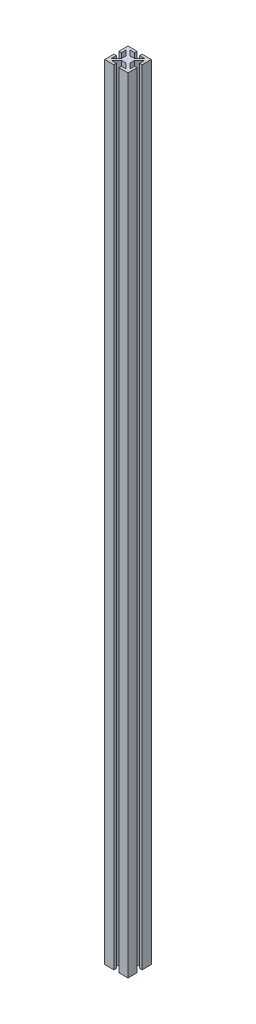
ISO-10303-21;
HEADER;
FILE_DESCRIPTION(('STEP AP214'),'2;1');
FILE_NAME('part.step','',(''),(''),'','','');
FILE_SCHEMA(('AUTOMOTIVE_DESIGN { 1 0 10303 214 1 1 1 1 }'));
ENDSEC;
DATA;
#1=APPLICATION_CONTEXT('core data for automotive mechanical design processes');
#2=APPLICATION_PROTOCOL_DEFINITION('international standard','automotive_design',2000,#1);
#3=PRODUCT_CONTEXT('',#1,'mechanical');
#4=PRODUCT('Part','Part','',(#3));
#5=PRODUCT_RELATED_PRODUCT_CATEGORY('part','',(#4));
#6=PRODUCT_DEFINITION_FORMATION('','',#4);
#7=PRODUCT_DEFINITION_CONTEXT('part definition',#1,'design');
#8=PRODUCT_DEFINITION('design','',#6,#7);
#9=PRODUCT_DEFINITION_SHAPE('','',#8);
#10=(LENGTH_UNIT() NAMED_UNIT(*) SI_UNIT(.MILLI.,.METRE.));
#11=(NAMED_UNIT(*) PLANE_ANGLE_UNIT() SI_UNIT($,.RADIAN.));
#12=(NAMED_UNIT(*) SI_UNIT($,.STERADIAN.) SOLID_ANGLE_UNIT());
#13=UNCERTAINTY_MEASURE_WITH_UNIT(LENGTH_MEASURE(1.E-05),#10,'distance_accuracy_value','');
#14=(GEOMETRIC_REPRESENTATION_CONTEXT(3) GLOBAL_UNCERTAINTY_ASSIGNED_CONTEXT((#13)) GLOBAL_UNIT_ASSIGNED_CONTEXT((#10,
#11,#12)) REPRESENTATION_CONTEXT('',''));
#15=CARTESIAN_POINT('',(0.,0.,0.));
#16=DIRECTION('',(0.,0.,1.));
#17=DIRECTION('',(1.,0.,0.));
#18=AXIS2_PLACEMENT_3D('',#15,#16,#17);
#19=CARTESIAN_POINT('',(-19.05,1282.7,-19.05));
#20=DIRECTION('',(1.,0.,0.));
#21=DIRECTION('',(0.,0.,-1.));
#22=AXIS2_PLACEMENT_3D('',#19,#20,#21);
#23=PLANE('',#22);
#24=DIRECTION('',(0.,0.,1.));
#25=VECTOR('',#24,1.);
#26=CARTESIAN_POINT('',(-19.05,0.,-19.05));
#27=LINE('',#26,#25);
#28=CARTESIAN_POINT('',(-19.05,0.,-19.05));
#29=VERTEX_POINT('',#28);
#30=CARTESIAN_POINT('',(-19.05,0.,-4.06399999999999));
#31=VERTEX_POINT('',#30);
#32=EDGE_CURVE('E299',#29,#31,#27,.T.);
#33=ORIENTED_EDGE('',*,*,#32,.T.);
#34=DIRECTION('',(0.,-1.,0.));
#35=VECTOR('',#34,1.);
#36=CARTESIAN_POINT('',(-19.05,1282.7,-4.06399999999999));
#37=LINE('',#36,#35);
#38=CARTESIAN_POINT('',(-19.05,1282.7,-4.06399999999999));
#39=VERTEX_POINT('',#38);
#40=EDGE_CURVE('E11',#39,#31,#37,.T.);
#41=ORIENTED_EDGE('',*,*,#40,.F.);
#42=DIRECTION('',(0.,0.,1.));
#43=VECTOR('',#42,1.);
#44=CARTESIAN_POINT('',(-19.05,1282.7,-19.05));
#45=LINE('',#44,#43);
#46=CARTESIAN_POINT('',(-19.05,1282.7,-19.05));
#47=VERTEX_POINT('',#46);
#48=EDGE_CURVE('E369',#47,#39,#45,.T.);
#49=ORIENTED_EDGE('',*,*,#48,.F.);
#50=DIRECTION('',(0.,-1.,0.));
#51=VECTOR('',#50,1.);
#52=CARTESIAN_POINT('',(-19.05,1282.7,-19.05));
#53=LINE('',#52,#51);
#54=EDGE_CURVE('E295',#47,#29,#53,.T.);
#55=ORIENTED_EDGE('',*,*,#54,.T.);
#56=EDGE_LOOP('',(#33,#41,#49,#55));
#57=FACE_BOUND('',#56,.T.);
#58=ADVANCED_FACE('F35',(#57),#23,.F.);
#59=CARTESIAN_POINT('',(-19.05,1282.7,-4.06399999999999));
#60=DIRECTION('',(0.,0.,-1.));
#61=DIRECTION('',(-1.,0.,0.));
#62=AXIS2_PLACEMENT_3D('',#59,#60,#61);
#63=PLANE('',#62);
#64=DIRECTION('',(1.,0.,0.));
#65=VECTOR('',#64,1.);
#66=CARTESIAN_POINT('',(-19.05,0.,-4.06399999999999));
#67=LINE('',#66,#65);
#68=CARTESIAN_POINT('',(-14.986,0.,-4.06399999999999));
#69=VERTEX_POINT('',#68);
#70=EDGE_CURVE('E302',#31,#69,#67,.T.);
#71=ORIENTED_EDGE('',*,*,#70,.T.);
#72=DIRECTION('',(0.,-1.,0.));
#73=VECTOR('',#72,1.);
#74=CARTESIAN_POINT('',(-14.986,1282.7,-4.06399999999999));
#75=LINE('',#74,#73);
#76=CARTESIAN_POINT('',(-14.986,1282.7,-4.06399999999999));
#77=VERTEX_POINT('',#76);
#78=EDGE_CURVE('E43',#77,#69,#75,.T.);
#79=ORIENTED_EDGE('',*,*,#78,.F.);
#80=DIRECTION('',(1.,0.,0.));
#81=VECTOR('',#80,1.);
#82=CARTESIAN_POINT('',(-19.05,1282.7,-4.06399999999999));
#83=LINE('',#82,#81);
#84=EDGE_CURVE('E178',#39,#77,#83,.T.);
#85=ORIENTED_EDGE('',*,*,#84,.F.);
#86=ORIENTED_EDGE('',*,*,#40,.T.);
#87=EDGE_LOOP('',(#71,#79,#85,#86));
#88=FACE_BOUND('',#87,.T.);
#89=ADVANCED_FACE('F567',(#88),#63,.F.);
#90=CARTESIAN_POINT('',(-14.986,1282.7,-4.06399999999999));
#91=DIRECTION('',(-1.,0.,0.));
#92=DIRECTION('',(0.,0.,1.));
#93=AXIS2_PLACEMENT_3D('',#90,#91,#92);
#94=PLANE('',#93);
#95=DIRECTION('',(0.,0.,-1.));
#96=VECTOR('',#95,1.);
#97=CARTESIAN_POINT('',(-14.986,0.,-4.06399999999999));
#98=LINE('',#97,#96);
#99=CARTESIAN_POINT('',(-14.986,0.,-12.1123180412578));
#100=VERTEX_POINT('',#99);
#101=EDGE_CURVE('E304',#69,#100,#98,.T.);
#102=ORIENTED_EDGE('',*,*,#101,.T.);
#103=DIRECTION('',(0.,-1.,0.));
#104=VECTOR('',#103,1.);
#105=CARTESIAN_POINT('',(-14.986,1282.7,-12.1123180412578));
#106=LINE('',#105,#104);
#107=CARTESIAN_POINT('',(-14.986,1282.7,-12.1123180412578));
#108=VERTEX_POINT('',#107);
#109=EDGE_CURVE('E460',#108,#100,#106,.T.);
#110=ORIENTED_EDGE('',*,*,#109,.F.);
#111=DIRECTION('',(0.,0.,-1.));
#112=VECTOR('',#111,1.);
#113=CARTESIAN_POINT('',(-14.986,1282.7,-4.06399999999999));
#114=LINE('',#113,#112);
#115=EDGE_CURVE('E468',#77,#108,#114,.T.);
#116=ORIENTED_EDGE('',*,*,#115,.F.);
#117=ORIENTED_EDGE('',*,*,#78,.T.);
#118=EDGE_LOOP('',(#102,#110,#116,#117));
#119=FACE_BOUND('',#118,.T.);
#120=ADVANCED_FACE('F466',(#119),#94,.F.);
#121=CARTESIAN_POINT('',(-14.986,1282.7,-12.1123180412578));
#122=DIRECTION('',(0.707106781186547,0.,-0.707106781186548));
#123=DIRECTION('',(-0.707106781186548,0.,-0.707106781186547));
#124=AXIS2_PLACEMENT_3D('',#121,#122,#123);
#125=PLANE('',#124);
#126=DIRECTION('',(0.707106781186548,0.,0.707106781186547));
#127=VECTOR('',#126,1.);
#128=CARTESIAN_POINT('',(-14.986,0.,-12.1123180412578));
#129=LINE('',#128,#127);
#130=CARTESIAN_POINT('',(-6.7564,0.,-3.88271804125786));
#131=VERTEX_POINT('',#130);
#132=EDGE_CURVE('E306',#100,#131,#129,.T.);
#133=ORIENTED_EDGE('',*,*,#132,.T.);
#134=DIRECTION('',(0.,-1.,0.));
#135=VECTOR('',#134,1.);
#136=CARTESIAN_POINT('',(-6.7564,1282.7,-3.88271804125786));
#137=LINE('',#136,#135);
#138=CARTESIAN_POINT('',(-6.7564,1282.7,-3.88271804125786));
#139=VERTEX_POINT('',#138);
#140=EDGE_CURVE('E457',#139,#131,#137,.T.);
#141=ORIENTED_EDGE('',*,*,#140,.F.);
#142=DIRECTION('',(0.707106781186548,0.,0.707106781186547));
#143=VECTOR('',#142,1.);
#144=CARTESIAN_POINT('',(-14.986,1282.7,-12.1123180412578));
#145=LINE('',#144,#143);
#146=EDGE_CURVE('E486',#108,#139,#145,.T.);
#147=ORIENTED_EDGE('',*,*,#146,.F.);
#148=ORIENTED_EDGE('',*,*,#109,.T.);
#149=EDGE_LOOP('',(#133,#141,#147,#148));
#150=FACE_BOUND('',#149,.T.);
#151=ADVANCED_FACE('F477',(#150),#125,.F.);
#152=CARTESIAN_POINT('',(-6.7564,1282.7,-3.88271804125786));
#153=DIRECTION('',(1.,0.,0.));
#154=DIRECTION('',(0.,0.,-1.));
#155=AXIS2_PLACEMENT_3D('',#152,#153,#154);
#156=PLANE('',#155);
#157=DIRECTION('',(0.,0.,1.));
#158=VECTOR('',#157,1.);
#159=CARTESIAN_POINT('',(-6.7564,0.,-3.88271804125786));
#160=LINE('',#159,#158);
#161=CARTESIAN_POINT('',(-6.7564,0.,3.88271804125787));
#162=VERTEX_POINT('',#161);
#163=EDGE_CURVE('E308',#131,#162,#160,.T.);
#164=ORIENTED_EDGE('',*,*,#163,.T.);
#165=DIRECTION('',(0.,-1.,0.));
#166=VECTOR('',#165,1.);
#167=CARTESIAN_POINT('',(-6.7564,1282.7,3.88271804125787));
#168=LINE('',#167,#166);
#169=CARTESIAN_POINT('',(-6.7564,1282.7,3.88271804125787));
#170=VERTEX_POINT('',#169);
#171=EDGE_CURVE('E454',#170,#162,#168,.T.);
#172=ORIENTED_EDGE('',*,*,#171,.F.);
#173=DIRECTION('',(0.,0.,1.));
#174=VECTOR('',#173,1.);
#175=CARTESIAN_POINT('',(-6.7564,1282.7,-3.88271804125786));
#176=LINE('',#175,#174);
#177=EDGE_CURVE('E483',#139,#170,#176,.T.);
#178=ORIENTED_EDGE('',*,*,#177,.F.);
#179=ORIENTED_EDGE('',*,*,#140,.T.);
#180=EDGE_LOOP('',(#164,#172,#178,#179));
#181=FACE_BOUND('',#180,.T.);
#182=ADVANCED_FACE('F481',(#181),#156,.F.);
#183=CARTESIAN_POINT('',(-14.986,1282.7,12.1123180412579));
#184=DIRECTION('',(0.707106781186548,0.,0.707106781186547));
#185=DIRECTION('',(0.707106781186547,0.,-0.707106781186548));
#186=AXIS2_PLACEMENT_3D('',#183,#184,#185);
#187=PLANE('',#186);
#188=DIRECTION('',(-0.707106781186547,0.,0.707106781186548));
#189=VECTOR('',#188,1.);
#190=CARTESIAN_POINT('',(-14.986,0.,12.1123180412579));
#191=LINE('',#190,#189);
#192=CARTESIAN_POINT('',(-14.986,0.,12.1123180412579));
#193=VERTEX_POINT('',#192);
#194=EDGE_CURVE('E310',#162,#193,#191,.T.);
#195=ORIENTED_EDGE('',*,*,#194,.T.);
#196=DIRECTION('',(0.,-1.,0.));
#197=VECTOR('',#196,1.);
#198=CARTESIAN_POINT('',(-14.986,1282.7,12.1123180412579));
#199=LINE('',#198,#197);
#200=CARTESIAN_POINT('',(-14.986,1282.7,12.1123180412579));
#201=VERTEX_POINT('',#200);
#202=EDGE_CURVE('E451',#201,#193,#199,.T.);
#203=ORIENTED_EDGE('',*,*,#202,.F.);
#204=DIRECTION('',(-0.707106781186547,0.,0.707106781186548));
#205=VECTOR('',#204,1.);
#206=CARTESIAN_POINT('',(-14.986,1282.7,12.1123180412579));
#207=LINE('',#206,#205);
#208=EDGE_CURVE('E485',#170,#201,#207,.T.);
#209=ORIENTED_EDGE('',*,*,#208,.F.);
#210=ORIENTED_EDGE('',*,*,#171,.T.);
#211=EDGE_LOOP('',(#195,#203,#209,#210));
#212=FACE_BOUND('',#211,.T.);
#213=ADVANCED_FACE('F580',(#212),#187,.F.);
#214=CARTESIAN_POINT('',(-14.986,1282.7,4.06399999999999));
#215=DIRECTION('',(-1.,0.,0.));
#216=DIRECTION('',(0.,0.,1.));
#217=AXIS2_PLACEMENT_3D('',#214,#215,#216);
#218=PLANE('',#217);
#219=DIRECTION('',(0.,0.,-1.));
#220=VECTOR('',#219,1.);
#221=CARTESIAN_POINT('',(-14.986,0.,4.06399999999999));
#222=LINE('',#221,#220);
#223=CARTESIAN_POINT('',(-14.986,0.,4.06399999999999));
#224=VERTEX_POINT('',#223);
#225=EDGE_CURVE('E312',#193,#224,#222,.T.);
#226=ORIENTED_EDGE('',*,*,#225,.T.);
#227=DIRECTION('',(0.,-1.,0.));
#228=VECTOR('',#227,1.);
#229=CARTESIAN_POINT('',(-14.986,1282.7,4.06399999999999));
#230=LINE('',#229,#228);
#231=CARTESIAN_POINT('',(-14.986,1282.7,4.06399999999999));
#232=VERTEX_POINT('',#231);
#233=EDGE_CURVE('E448',#232,#224,#230,.T.);
#234=ORIENTED_EDGE('',*,*,#233,.F.);
#235=DIRECTION('',(0.,0.,-1.));
#236=VECTOR('',#235,1.);
#237=CARTESIAN_POINT('',(-14.986,1282.7,4.06399999999999));
#238=LINE('',#237,#236);
#239=EDGE_CURVE('E488',#201,#232,#238,.T.);
#240=ORIENTED_EDGE('',*,*,#239,.F.);
#241=ORIENTED_EDGE('',*,*,#202,.T.);
#242=EDGE_LOOP('',(#226,#234,#240,#241));
#243=FACE_BOUND('',#242,.T.);
#244=ADVANCED_FACE('F583',(#243),#218,.F.);
#245=CARTESIAN_POINT('',(-19.05,1282.7,4.06399999999999));
#246=DIRECTION('',(0.,0.,1.));
#247=DIRECTION('',(1.,0.,0.));
#248=AXIS2_PLACEMENT_3D('',#245,#246,#247);
#249=PLANE('',#248);
#250=DIRECTION('',(-1.,0.,0.));
#251=VECTOR('',#250,1.);
#252=CARTESIAN_POINT('',(-19.05,0.,4.06399999999999));
#253=LINE('',#252,#251);
#254=CARTESIAN_POINT('',(-19.05,0.,4.06399999999999));
#255=VERTEX_POINT('',#254);
#256=EDGE_CURVE('E314',#224,#255,#253,.T.);
#257=ORIENTED_EDGE('',*,*,#256,.T.);
#258=DIRECTION('',(0.,-1.,0.));
#259=VECTOR('',#258,1.);
#260=CARTESIAN_POINT('',(-19.05,1282.7,4.06399999999999));
#261=LINE('',#260,#259);
#262=CARTESIAN_POINT('',(-19.05,1282.7,4.06399999999999));
#263=VERTEX_POINT('',#262);
#264=EDGE_CURVE('E445',#263,#255,#261,.T.);
#265=ORIENTED_EDGE('',*,*,#264,.F.);
#266=DIRECTION('',(-1.,0.,0.));
#267=VECTOR('',#266,1.);
#268=CARTESIAN_POINT('',(-19.05,1282.7,4.06399999999999));
#269=LINE('',#268,#267);
#270=EDGE_CURVE('E494',#232,#263,#269,.T.);
#271=ORIENTED_EDGE('',*,*,#270,.F.);
#272=ORIENTED_EDGE('',*,*,#233,.T.);
#273=EDGE_LOOP('',(#257,#265,#271,#272));
#274=FACE_BOUND('',#273,.T.);
#275=ADVANCED_FACE('F587',(#274),#249,.F.);
#276=CARTESIAN_POINT('',(-19.05,1282.7,19.05));
#277=DIRECTION('',(1.,0.,0.));
#278=DIRECTION('',(0.,0.,-1.));
#279=AXIS2_PLACEMENT_3D('',#276,#277,#278);
#280=PLANE('',#279);
#281=DIRECTION('',(0.,0.,1.));
#282=VECTOR('',#281,1.);
#283=CARTESIAN_POINT('',(-19.05,0.,19.05));
#284=LINE('',#283,#282);
#285=CARTESIAN_POINT('',(-19.05,0.,19.05));
#286=VERTEX_POINT('',#285);
#287=EDGE_CURVE('E316',#255,#286,#284,.T.);
#288=ORIENTED_EDGE('',*,*,#287,.T.);
#289=DIRECTION('',(0.,-1.,0.));
#290=VECTOR('',#289,1.);
#291=CARTESIAN_POINT('',(-19.05,1282.7,19.05));
#292=LINE('',#291,#290);
#293=CARTESIAN_POINT('',(-19.05,1282.7,19.05));
#294=VERTEX_POINT('',#293);
#295=EDGE_CURVE('E442',#294,#286,#292,.T.);
#296=ORIENTED_EDGE('',*,*,#295,.F.);
#297=DIRECTION('',(0.,0.,1.));
#298=VECTOR('',#297,1.);
#299=CARTESIAN_POINT('',(-19.05,1282.7,19.05));
#300=LINE('',#299,#298);
#301=EDGE_CURVE('E496',#263,#294,#300,.T.);
#302=ORIENTED_EDGE('',*,*,#301,.F.);
#303=ORIENTED_EDGE('',*,*,#264,.T.);
#304=EDGE_LOOP('',(#288,#296,#302,#303));
#305=FACE_BOUND('',#304,.T.);
#306=ADVANCED_FACE('F591',(#305),#280,.F.);
#307=CARTESIAN_POINT('',(-19.05,1282.7,19.05));
#308=DIRECTION('',(0.,0.,-1.));
#309=DIRECTION('',(-1.,0.,0.));
#310=AXIS2_PLACEMENT_3D('',#307,#308,#309);
#311=PLANE('',#310);
#312=DIRECTION('',(1.,0.,0.));
#313=VECTOR('',#312,1.);
#314=CARTESIAN_POINT('',(-19.05,0.,19.05));
#315=LINE('',#314,#313);
#316=CARTESIAN_POINT('',(-4.064,0.,19.05));
#317=VERTEX_POINT('',#316);
#318=EDGE_CURVE('E318',#286,#317,#315,.T.);
#319=ORIENTED_EDGE('',*,*,#318,.T.);
#320=DIRECTION('',(0.,-1.,0.));
#321=VECTOR('',#320,1.);
#322=CARTESIAN_POINT('',(-4.064,1282.7,19.05));
#323=LINE('',#322,#321);
#324=CARTESIAN_POINT('',(-4.064,1282.7,19.05));
#325=VERTEX_POINT('',#324);
#326=EDGE_CURVE('E439',#325,#317,#323,.T.);
#327=ORIENTED_EDGE('',*,*,#326,.F.);
#328=DIRECTION('',(1.,0.,0.));
#329=VECTOR('',#328,1.);
#330=CARTESIAN_POINT('',(-19.05,1282.7,19.05));
#331=LINE('',#330,#329);
#332=EDGE_CURVE('E498',#294,#325,#331,.T.);
#333=ORIENTED_EDGE('',*,*,#332,.F.);
#334=ORIENTED_EDGE('',*,*,#295,.T.);
#335=EDGE_LOOP('',(#319,#327,#333,#334));
#336=FACE_BOUND('',#335,.T.);
#337=ADVANCED_FACE('F595',(#336),#311,.F.);
#338=CARTESIAN_POINT('',(-4.064,1282.7,19.05));
#339=DIRECTION('',(-1.,0.,0.));
#340=DIRECTION('',(0.,0.,1.));
#341=AXIS2_PLACEMENT_3D('',#338,#339,#340);
#342=PLANE('',#341);
#343=DIRECTION('',(0.,0.,-1.));
#344=VECTOR('',#343,1.);
#345=CARTESIAN_POINT('',(-4.064,0.,19.05));
#346=LINE('',#345,#344);
#347=CARTESIAN_POINT('',(-4.064,0.,14.986));
#348=VERTEX_POINT('',#347);
#349=EDGE_CURVE('E320',#317,#348,#346,.T.);
#350=ORIENTED_EDGE('',*,*,#349,.T.);
#351=DIRECTION('',(0.,-1.,0.));
#352=VECTOR('',#351,1.);
#353=CARTESIAN_POINT('',(-4.064,1282.7,14.986));
#354=LINE('',#353,#352);
#355=CARTESIAN_POINT('',(-4.064,1282.7,14.986));
#356=VERTEX_POINT('',#355);
#357=EDGE_CURVE('E436',#356,#348,#354,.T.);
#358=ORIENTED_EDGE('',*,*,#357,.F.);
#359=DIRECTION('',(0.,0.,-1.));
#360=VECTOR('',#359,1.);
#361=CARTESIAN_POINT('',(-4.064,1282.7,19.05));
#362=LINE('',#361,#360);
#363=EDGE_CURVE('E500',#325,#356,#362,.T.);
#364=ORIENTED_EDGE('',*,*,#363,.F.);
#365=ORIENTED_EDGE('',*,*,#326,.T.);
#366=EDGE_LOOP('',(#350,#358,#364,#365));
#367=FACE_BOUND('',#366,.T.);
#368=ADVANCED_FACE('F599',(#367),#342,.F.);
#369=CARTESIAN_POINT('',(-4.064,1282.7,14.986));
#370=DIRECTION('',(0.,0.,1.));
#371=DIRECTION('',(1.,0.,0.));
#372=AXIS2_PLACEMENT_3D('',#369,#370,#371);
#373=PLANE('',#372);
#374=DIRECTION('',(-1.,0.,0.));
#375=VECTOR('',#374,1.);
#376=CARTESIAN_POINT('',(-4.064,0.,14.986));
#377=LINE('',#376,#375);
#378=CARTESIAN_POINT('',(-12.1123180412579,0.,14.986));
#379=VERTEX_POINT('',#378);
#380=EDGE_CURVE('E322',#348,#379,#377,.T.);
#381=ORIENTED_EDGE('',*,*,#380,.T.);
#382=DIRECTION('',(0.,-1.,0.));
#383=VECTOR('',#382,1.);
#384=CARTESIAN_POINT('',(-12.1123180412579,1282.7,14.986));
#385=LINE('',#384,#383);
#386=CARTESIAN_POINT('',(-12.1123180412579,1282.7,14.986));
#387=VERTEX_POINT('',#386);
#388=EDGE_CURVE('E433',#387,#379,#385,.T.);
#389=ORIENTED_EDGE('',*,*,#388,.F.);
#390=DIRECTION('',(-1.,0.,0.));
#391=VECTOR('',#390,1.);
#392=CARTESIAN_POINT('',(-4.064,1282.7,14.986));
#393=LINE('',#392,#391);
#394=EDGE_CURVE('E502',#356,#387,#393,.T.);
#395=ORIENTED_EDGE('',*,*,#394,.F.);
#396=ORIENTED_EDGE('',*,*,#357,.T.);
#397=EDGE_LOOP('',(#381,#389,#395,#396));
#398=FACE_BOUND('',#397,.T.);
#399=ADVANCED_FACE('F603',(#398),#373,.F.);
#400=CARTESIAN_POINT('',(-12.1123180412579,1282.7,14.986));
#401=DIRECTION('',(-0.707106781186548,0.,-0.707106781186547));
#402=DIRECTION('',(-0.707106781186547,0.,0.707106781186548));
#403=AXIS2_PLACEMENT_3D('',#400,#401,#402);
#404=PLANE('',#403);
#405=DIRECTION('',(0.707106781186547,0.,-0.707106781186548));
#406=VECTOR('',#405,1.);
#407=CARTESIAN_POINT('',(-12.1123180412579,0.,14.986));
#408=LINE('',#407,#406);
#409=CARTESIAN_POINT('',(-3.88271804125786,0.,6.7564));
#410=VERTEX_POINT('',#409);
#411=EDGE_CURVE('E324',#379,#410,#408,.T.);
#412=ORIENTED_EDGE('',*,*,#411,.T.);
#413=DIRECTION('',(0.,-1.,0.));
#414=VECTOR('',#413,1.);
#415=CARTESIAN_POINT('',(-3.88271804125786,1282.7,6.7564));
#416=LINE('',#415,#414);
#417=CARTESIAN_POINT('',(-3.88271804125786,1282.7,6.7564));
#418=VERTEX_POINT('',#417);
#419=EDGE_CURVE('E430',#418,#410,#416,.T.);
#420=ORIENTED_EDGE('',*,*,#419,.F.);
#421=DIRECTION('',(0.707106781186547,0.,-0.707106781186548));
#422=VECTOR('',#421,1.);
#423=CARTESIAN_POINT('',(-12.1123180412579,1282.7,14.986));
#424=LINE('',#423,#422);
#425=EDGE_CURVE('E504',#387,#418,#424,.T.);
#426=ORIENTED_EDGE('',*,*,#425,.F.);
#427=ORIENTED_EDGE('',*,*,#388,.T.);
#428=EDGE_LOOP('',(#412,#420,#426,#427));
#429=FACE_BOUND('',#428,.T.);
#430=ADVANCED_FACE('F607',(#429),#404,.F.);
#431=CARTESIAN_POINT('',(-3.88271804125786,1282.7,6.7564));
#432=DIRECTION('',(0.,0.,-1.));
#433=DIRECTION('',(-1.,0.,0.));
#434=AXIS2_PLACEMENT_3D('',#431,#432,#433);
#435=PLANE('',#434);
#436=DIRECTION('',(1.,0.,0.));
#437=VECTOR('',#436,1.);
#438=CARTESIAN_POINT('',(-3.88271804125786,0.,6.7564));
#439=LINE('',#438,#437);
#440=CARTESIAN_POINT('',(3.88271804125786,0.,6.7564));
#441=VERTEX_POINT('',#440);
#442=EDGE_CURVE('E326',#410,#441,#439,.T.);
#443=ORIENTED_EDGE('',*,*,#442,.T.);
#444=DIRECTION('',(0.,-1.,0.));
#445=VECTOR('',#444,1.);
#446=CARTESIAN_POINT('',(3.88271804125786,1282.7,6.7564));
#447=LINE('',#446,#445);
#448=CARTESIAN_POINT('',(3.88271804125786,1282.7,6.7564));
#449=VERTEX_POINT('',#448);
#450=EDGE_CURVE('E427',#449,#441,#447,.T.);
#451=ORIENTED_EDGE('',*,*,#450,.F.);
#452=DIRECTION('',(1.,0.,0.));
#453=VECTOR('',#452,1.);
#454=CARTESIAN_POINT('',(-3.88271804125786,1282.7,6.7564));
#455=LINE('',#454,#453);
#456=EDGE_CURVE('E506',#418,#449,#455,.T.);
#457=ORIENTED_EDGE('',*,*,#456,.F.);
#458=ORIENTED_EDGE('',*,*,#419,.T.);
#459=EDGE_LOOP('',(#443,#451,#457,#458));
#460=FACE_BOUND('',#459,.T.);
#461=ADVANCED_FACE('F611',(#460),#435,.F.);
#462=CARTESIAN_POINT('',(12.1123180412579,1282.7,14.986));
#463=DIRECTION('',(0.707106781186548,0.,-0.707106781186548));
#464=DIRECTION('',(-0.707106781186548,0.,-0.707106781186548));
#465=AXIS2_PLACEMENT_3D('',#462,#463,#464);
#466=PLANE('',#465);
#467=DIRECTION('',(0.707106781186547,0.,0.707106781186547));
#468=VECTOR('',#467,1.);
#469=CARTESIAN_POINT('',(12.1123180412579,0.,14.986));
#470=LINE('',#469,#468);
#471=CARTESIAN_POINT('',(12.1123180412579,0.,14.986));
#472=VERTEX_POINT('',#471);
#473=EDGE_CURVE('E328',#441,#472,#470,.T.);
#474=ORIENTED_EDGE('',*,*,#473,.T.);
#475=DIRECTION('',(0.,-1.,0.));
#476=VECTOR('',#475,1.);
#477=CARTESIAN_POINT('',(12.1123180412579,1282.7,14.986));
#478=LINE('',#477,#476);
#479=CARTESIAN_POINT('',(12.1123180412579,1282.7,14.986));
#480=VERTEX_POINT('',#479);
#481=EDGE_CURVE('E424',#480,#472,#478,.T.);
#482=ORIENTED_EDGE('',*,*,#481,.F.);
#483=DIRECTION('',(0.707106781186547,0.,0.707106781186547));
#484=VECTOR('',#483,1.);
#485=CARTESIAN_POINT('',(12.1123180412579,1282.7,14.986));
#486=LINE('',#485,#484);
#487=EDGE_CURVE('E508',#449,#480,#486,.T.);
#488=ORIENTED_EDGE('',*,*,#487,.F.);
#489=ORIENTED_EDGE('',*,*,#450,.T.);
#490=EDGE_LOOP('',(#474,#482,#488,#489));
#491=FACE_BOUND('',#490,.T.);
#492=ADVANCED_FACE('F615',(#491),#466,.F.);
#493=CARTESIAN_POINT('',(4.064,1282.7,14.986));
#494=DIRECTION('',(0.,0.,1.));
#495=DIRECTION('',(1.,0.,0.));
#496=AXIS2_PLACEMENT_3D('',#493,#494,#495);
#497=PLANE('',#496);
#498=DIRECTION('',(-1.,0.,0.));
#499=VECTOR('',#498,1.);
#500=CARTESIAN_POINT('',(4.064,0.,14.986));
#501=LINE('',#500,#499);
#502=CARTESIAN_POINT('',(4.064,0.,14.986));
#503=VERTEX_POINT('',#502);
#504=EDGE_CURVE('E330',#472,#503,#501,.T.);
#505=ORIENTED_EDGE('',*,*,#504,.T.);
#506=DIRECTION('',(0.,-1.,0.));
#507=VECTOR('',#506,1.);
#508=CARTESIAN_POINT('',(4.064,1282.7,14.986));
#509=LINE('',#508,#507);
#510=CARTESIAN_POINT('',(4.064,1282.7,14.986));
#511=VERTEX_POINT('',#510);
#512=EDGE_CURVE('E421',#511,#503,#509,.T.);
#513=ORIENTED_EDGE('',*,*,#512,.F.);
#514=DIRECTION('',(-1.,0.,0.));
#515=VECTOR('',#514,1.);
#516=CARTESIAN_POINT('',(4.064,1282.7,14.986));
#517=LINE('',#516,#515);
#518=EDGE_CURVE('E510',#480,#511,#517,.T.);
#519=ORIENTED_EDGE('',*,*,#518,.F.);
#520=ORIENTED_EDGE('',*,*,#481,.T.);
#521=EDGE_LOOP('',(#505,#513,#519,#520));
#522=FACE_BOUND('',#521,.T.);
#523=ADVANCED_FACE('F619',(#522),#497,.F.);
#524=CARTESIAN_POINT('',(4.06400000000001,1282.7,19.05));
#525=DIRECTION('',(1.,0.,0.));
#526=DIRECTION('',(0.,0.,-1.));
#527=AXIS2_PLACEMENT_3D('',#524,#525,#526);
#528=PLANE('',#527);
#529=DIRECTION('',(0.,0.,1.));
#530=VECTOR('',#529,1.);
#531=CARTESIAN_POINT('',(4.06400000000001,0.,19.05));
#532=LINE('',#531,#530);
#533=CARTESIAN_POINT('',(4.06400000000001,0.,19.05));
#534=VERTEX_POINT('',#533);
#535=EDGE_CURVE('E332',#503,#534,#532,.T.);
#536=ORIENTED_EDGE('',*,*,#535,.T.);
#537=DIRECTION('',(0.,-1.,0.));
#538=VECTOR('',#537,1.);
#539=CARTESIAN_POINT('',(4.06400000000001,1282.7,19.05));
#540=LINE('',#539,#538);
#541=CARTESIAN_POINT('',(4.06400000000001,1282.7,19.05));
#542=VERTEX_POINT('',#541);
#543=EDGE_CURVE('E418',#542,#534,#540,.T.);
#544=ORIENTED_EDGE('',*,*,#543,.F.);
#545=DIRECTION('',(0.,0.,1.));
#546=VECTOR('',#545,1.);
#547=CARTESIAN_POINT('',(4.06400000000001,1282.7,19.05));
#548=LINE('',#547,#546);
#549=EDGE_CURVE('E512',#511,#542,#548,.T.);
#550=ORIENTED_EDGE('',*,*,#549,.F.);
#551=ORIENTED_EDGE('',*,*,#512,.T.);
#552=EDGE_LOOP('',(#536,#544,#550,#551));
#553=FACE_BOUND('',#552,.T.);
#554=ADVANCED_FACE('F623',(#553),#528,.F.);
#555=CARTESIAN_POINT('',(19.05,1282.7,19.05));
#556=DIRECTION('',(0.,0.,-1.));
#557=DIRECTION('',(-1.,0.,0.));
#558=AXIS2_PLACEMENT_3D('',#555,#556,#557);
#559=PLANE('',#558);
#560=DIRECTION('',(1.,0.,0.));
#561=VECTOR('',#560,1.);
#562=CARTESIAN_POINT('',(19.05,0.,19.05));
#563=LINE('',#562,#561);
#564=CARTESIAN_POINT('',(19.05,0.,19.05));
#565=VERTEX_POINT('',#564);
#566=EDGE_CURVE('E334',#534,#565,#563,.T.);
#567=ORIENTED_EDGE('',*,*,#566,.T.);
#568=DIRECTION('',(0.,-1.,0.));
#569=VECTOR('',#568,1.);
#570=CARTESIAN_POINT('',(19.05,1282.7,19.05));
#571=LINE('',#570,#569);
#572=CARTESIAN_POINT('',(19.05,1282.7,19.05));
#573=VERTEX_POINT('',#572);
#574=EDGE_CURVE('E415',#573,#565,#571,.T.);
#575=ORIENTED_EDGE('',*,*,#574,.F.);
#576=DIRECTION('',(1.,0.,0.));
#577=VECTOR('',#576,1.);
#578=CARTESIAN_POINT('',(19.05,1282.7,19.05));
#579=LINE('',#578,#577);
#580=EDGE_CURVE('E514',#542,#573,#579,.T.);
#581=ORIENTED_EDGE('',*,*,#580,.F.);
#582=ORIENTED_EDGE('',*,*,#543,.T.);
#583=EDGE_LOOP('',(#567,#575,#581,#582));
#584=FACE_BOUND('',#583,.T.);
#585=ADVANCED_FACE('F627',(#584),#559,.F.);
#586=CARTESIAN_POINT('',(19.05,1282.7,19.05));
#587=DIRECTION('',(-1.,0.,0.));
#588=DIRECTION('',(0.,0.,1.));
#589=AXIS2_PLACEMENT_3D('',#586,#587,#588);
#590=PLANE('',#589);
#591=DIRECTION('',(0.,0.,-1.));
#592=VECTOR('',#591,1.);
#593=CARTESIAN_POINT('',(19.05,0.,19.05));
#594=LINE('',#593,#592);
#595=CARTESIAN_POINT('',(19.05,0.,4.06399999999999));
#596=VERTEX_POINT('',#595);
#597=EDGE_CURVE('E336',#565,#596,#594,.T.);
#598=ORIENTED_EDGE('',*,*,#597,.T.);
#599=DIRECTION('',(0.,-1.,0.));
#600=VECTOR('',#599,1.);
#601=CARTESIAN_POINT('',(19.05,1282.7,4.06399999999999));
#602=LINE('',#601,#600);
#603=CARTESIAN_POINT('',(19.05,1282.7,4.06399999999999));
#604=VERTEX_POINT('',#603);
#605=EDGE_CURVE('E412',#604,#596,#602,.T.);
#606=ORIENTED_EDGE('',*,*,#605,.F.);
#607=DIRECTION('',(0.,0.,-1.));
#608=VECTOR('',#607,1.);
#609=CARTESIAN_POINT('',(19.05,1282.7,19.05));
#610=LINE('',#609,#608);
#611=EDGE_CURVE('E516',#573,#604,#610,.T.);
#612=ORIENTED_EDGE('',*,*,#611,.F.);
#613=ORIENTED_EDGE('',*,*,#574,.T.);
#614=EDGE_LOOP('',(#598,#606,#612,#613));
#615=FACE_BOUND('',#614,.T.);
#616=ADVANCED_FACE('F631',(#615),#590,.F.);
#617=CARTESIAN_POINT('',(19.05,1282.7,4.06399999999999));
#618=DIRECTION('',(0.,0.,1.));
#619=DIRECTION('',(1.,0.,0.));
#620=AXIS2_PLACEMENT_3D('',#617,#618,#619);
#621=PLANE('',#620);
#622=DIRECTION('',(-1.,0.,0.));
#623=VECTOR('',#622,1.);
#624=CARTESIAN_POINT('',(19.05,0.,4.06399999999999));
#625=LINE('',#624,#623);
#626=CARTESIAN_POINT('',(14.986,0.,4.06399999999999));
#627=VERTEX_POINT('',#626);
#628=EDGE_CURVE('E338',#596,#627,#625,.T.);
#629=ORIENTED_EDGE('',*,*,#628,.T.);
#630=DIRECTION('',(0.,-1.,0.));
#631=VECTOR('',#630,1.);
#632=CARTESIAN_POINT('',(14.986,1282.7,4.06399999999999));
#633=LINE('',#632,#631);
#634=CARTESIAN_POINT('',(14.986,1282.7,4.06399999999999));
#635=VERTEX_POINT('',#634);
#636=EDGE_CURVE('E409',#635,#627,#633,.T.);
#637=ORIENTED_EDGE('',*,*,#636,.F.);
#638=DIRECTION('',(-1.,0.,0.));
#639=VECTOR('',#638,1.);
#640=CARTESIAN_POINT('',(19.05,1282.7,4.06399999999999));
#641=LINE('',#640,#639);
#642=EDGE_CURVE('E518',#604,#635,#641,.T.);
#643=ORIENTED_EDGE('',*,*,#642,.F.);
#644=ORIENTED_EDGE('',*,*,#605,.T.);
#645=EDGE_LOOP('',(#629,#637,#643,#644));
#646=FACE_BOUND('',#645,.T.);
#647=ADVANCED_FACE('F635',(#646),#621,.F.);
#648=CARTESIAN_POINT('',(14.986,1282.7,4.06399999999999));
#649=DIRECTION('',(1.,0.,0.));
#650=DIRECTION('',(0.,0.,-1.));
#651=AXIS2_PLACEMENT_3D('',#648,#649,#650);
#652=PLANE('',#651);
#653=DIRECTION('',(0.,0.,1.));
#654=VECTOR('',#653,1.);
#655=CARTESIAN_POINT('',(14.986,0.,4.06399999999999));
#656=LINE('',#655,#654);
#657=CARTESIAN_POINT('',(14.986,0.,12.1123180412579));
#658=VERTEX_POINT('',#657);
#659=EDGE_CURVE('E340',#627,#658,#656,.T.);
#660=ORIENTED_EDGE('',*,*,#659,.T.);
#661=DIRECTION('',(0.,-1.,0.));
#662=VECTOR('',#661,1.);
#663=CARTESIAN_POINT('',(14.986,1282.7,12.1123180412579));
#664=LINE('',#663,#662);
#665=CARTESIAN_POINT('',(14.986,1282.7,12.1123180412579));
#666=VERTEX_POINT('',#665);
#667=EDGE_CURVE('E406',#666,#658,#664,.T.);
#668=ORIENTED_EDGE('',*,*,#667,.F.);
#669=DIRECTION('',(0.,0.,1.));
#670=VECTOR('',#669,1.);
#671=CARTESIAN_POINT('',(14.986,1282.7,4.06399999999999));
#672=LINE('',#671,#670);
#673=EDGE_CURVE('E520',#635,#666,#672,.T.);
#674=ORIENTED_EDGE('',*,*,#673,.F.);
#675=ORIENTED_EDGE('',*,*,#636,.T.);
#676=EDGE_LOOP('',(#660,#668,#674,#675));
#677=FACE_BOUND('',#676,.T.);
#678=ADVANCED_FACE('F639',(#677),#652,.F.);
#679=CARTESIAN_POINT('',(14.986,1282.7,12.1123180412579));
#680=DIRECTION('',(-0.707106781186548,0.,0.707106781186548));
#681=DIRECTION('',(0.707106781186548,0.,0.707106781186548));
#682=AXIS2_PLACEMENT_3D('',#679,#680,#681);
#683=PLANE('',#682);
#684=DIRECTION('',(-0.707106781186547,0.,-0.707106781186547));
#685=VECTOR('',#684,1.);
#686=CARTESIAN_POINT('',(14.986,0.,12.1123180412579));
#687=LINE('',#686,#685);
#688=CARTESIAN_POINT('',(6.7564,0.,3.88271804125787));
#689=VERTEX_POINT('',#688);
#690=EDGE_CURVE('E342',#658,#689,#687,.T.);
#691=ORIENTED_EDGE('',*,*,#690,.T.);
#692=DIRECTION('',(0.,-1.,0.));
#693=VECTOR('',#692,1.);
#694=CARTESIAN_POINT('',(6.7564,1282.7,3.88271804125787));
#695=LINE('',#694,#693);
#696=CARTESIAN_POINT('',(6.7564,1282.7,3.88271804125787));
#697=VERTEX_POINT('',#696);
#698=EDGE_CURVE('E403',#697,#689,#695,.T.);
#699=ORIENTED_EDGE('',*,*,#698,.F.);
#700=DIRECTION('',(-0.707106781186547,0.,-0.707106781186547));
#701=VECTOR('',#700,1.);
#702=CARTESIAN_POINT('',(14.986,1282.7,12.1123180412579));
#703=LINE('',#702,#701);
#704=EDGE_CURVE('E522',#666,#697,#703,.T.);
#705=ORIENTED_EDGE('',*,*,#704,.F.);
#706=ORIENTED_EDGE('',*,*,#667,.T.);
#707=EDGE_LOOP('',(#691,#699,#705,#706));
#708=FACE_BOUND('',#707,.T.);
#709=ADVANCED_FACE('F643',(#708),#683,.F.);
#710=CARTESIAN_POINT('',(6.7564,1282.7,-3.88271804125786));
#711=DIRECTION('',(-1.,0.,0.));
#712=DIRECTION('',(0.,0.,1.));
#713=AXIS2_PLACEMENT_3D('',#710,#711,#712);
#714=PLANE('',#713);
#715=DIRECTION('',(0.,0.,-1.));
#716=VECTOR('',#715,1.);
#717=CARTESIAN_POINT('',(6.7564,0.,-3.88271804125786));
#718=LINE('',#717,#716);
#719=CARTESIAN_POINT('',(6.7564,0.,-3.88271804125786));
#720=VERTEX_POINT('',#719);
#721=EDGE_CURVE('E344',#689,#720,#718,.T.);
#722=ORIENTED_EDGE('',*,*,#721,.T.);
#723=DIRECTION('',(0.,-1.,0.));
#724=VECTOR('',#723,1.);
#725=CARTESIAN_POINT('',(6.7564,1282.7,-3.88271804125786));
#726=LINE('',#725,#724);
#727=CARTESIAN_POINT('',(6.7564,1282.7,-3.88271804125786));
#728=VERTEX_POINT('',#727);
#729=EDGE_CURVE('E400',#728,#720,#726,.T.);
#730=ORIENTED_EDGE('',*,*,#729,.F.);
#731=DIRECTION('',(0.,0.,-1.));
#732=VECTOR('',#731,1.);
#733=CARTESIAN_POINT('',(6.7564,1282.7,-3.88271804125786));
#734=LINE('',#733,#732);
#735=EDGE_CURVE('E524',#697,#728,#734,.T.);
#736=ORIENTED_EDGE('',*,*,#735,.F.);
#737=ORIENTED_EDGE('',*,*,#698,.T.);
#738=EDGE_LOOP('',(#722,#730,#736,#737));
#739=FACE_BOUND('',#738,.T.);
#740=ADVANCED_FACE('F647',(#739),#714,.F.);
#741=CARTESIAN_POINT('',(14.986,1282.7,-12.1123180412579));
#742=DIRECTION('',(-0.707106781186547,0.,-0.707106781186548));
#743=DIRECTION('',(-0.707106781186548,0.,0.707106781186547));
#744=AXIS2_PLACEMENT_3D('',#741,#742,#743);
#745=PLANE('',#744);
#746=DIRECTION('',(0.707106781186548,0.,-0.707106781186547));
#747=VECTOR('',#746,1.);
#748=CARTESIAN_POINT('',(14.986,0.,-12.1123180412579));
#749=LINE('',#748,#747);
#750=CARTESIAN_POINT('',(14.986,0.,-12.1123180412579));
#751=VERTEX_POINT('',#750);
#752=EDGE_CURVE('E346',#720,#751,#749,.T.);
#753=ORIENTED_EDGE('',*,*,#752,.T.);
#754=DIRECTION('',(0.,-1.,0.));
#755=VECTOR('',#754,1.);
#756=CARTESIAN_POINT('',(14.986,1282.7,-12.1123180412579));
#757=LINE('',#756,#755);
#758=CARTESIAN_POINT('',(14.986,1282.7,-12.1123180412579));
#759=VERTEX_POINT('',#758);
#760=EDGE_CURVE('E397',#759,#751,#757,.T.);
#761=ORIENTED_EDGE('',*,*,#760,.F.);
#762=DIRECTION('',(0.707106781186548,0.,-0.707106781186547));
#763=VECTOR('',#762,1.);
#764=CARTESIAN_POINT('',(14.986,1282.7,-12.1123180412579));
#765=LINE('',#764,#763);
#766=EDGE_CURVE('E526',#728,#759,#765,.T.);
#767=ORIENTED_EDGE('',*,*,#766,.F.);
#768=ORIENTED_EDGE('',*,*,#729,.T.);
#769=EDGE_LOOP('',(#753,#761,#767,#768));
#770=FACE_BOUND('',#769,.T.);
#771=ADVANCED_FACE('F651',(#770),#745,.F.);
#772=CARTESIAN_POINT('',(14.986,1282.7,-4.06399999999999));
#773=DIRECTION('',(1.,0.,0.));
#774=DIRECTION('',(0.,0.,-1.));
#775=AXIS2_PLACEMENT_3D('',#772,#773,#774);
#776=PLANE('',#775);
#777=DIRECTION('',(0.,0.,1.));
#778=VECTOR('',#777,1.);
#779=CARTESIAN_POINT('',(14.986,0.,-4.06399999999999));
#780=LINE('',#779,#778);
#781=CARTESIAN_POINT('',(14.986,0.,-4.06399999999999));
#782=VERTEX_POINT('',#781);
#783=EDGE_CURVE('E348',#751,#782,#780,.T.);
#784=ORIENTED_EDGE('',*,*,#783,.T.);
#785=DIRECTION('',(0.,-1.,0.));
#786=VECTOR('',#785,1.);
#787=CARTESIAN_POINT('',(14.986,1282.7,-4.06399999999999));
#788=LINE('',#787,#786);
#789=CARTESIAN_POINT('',(14.986,1282.7,-4.06399999999999));
#790=VERTEX_POINT('',#789);
#791=EDGE_CURVE('E394',#790,#782,#788,.T.);
#792=ORIENTED_EDGE('',*,*,#791,.F.);
#793=DIRECTION('',(0.,0.,1.));
#794=VECTOR('',#793,1.);
#795=CARTESIAN_POINT('',(14.986,1282.7,-4.06399999999999));
#796=LINE('',#795,#794);
#797=EDGE_CURVE('E528',#759,#790,#796,.T.);
#798=ORIENTED_EDGE('',*,*,#797,.F.);
#799=ORIENTED_EDGE('',*,*,#760,.T.);
#800=EDGE_LOOP('',(#784,#792,#798,#799));
#801=FACE_BOUND('',#800,.T.);
#802=ADVANCED_FACE('F655',(#801),#776,.F.);
#803=CARTESIAN_POINT('',(19.05,1282.7,-4.06399999999999));
#804=DIRECTION('',(0.,0.,-1.));
#805=DIRECTION('',(-1.,0.,0.));
#806=AXIS2_PLACEMENT_3D('',#803,#804,#805);
#807=PLANE('',#806);
#808=DIRECTION('',(1.,0.,0.));
#809=VECTOR('',#808,1.);
#810=CARTESIAN_POINT('',(19.05,0.,-4.06399999999999));
#811=LINE('',#810,#809);
#812=CARTESIAN_POINT('',(19.05,0.,-4.06399999999999));
#813=VERTEX_POINT('',#812);
#814=EDGE_CURVE('E350',#782,#813,#811,.T.);
#815=ORIENTED_EDGE('',*,*,#814,.T.);
#816=DIRECTION('',(0.,-1.,0.));
#817=VECTOR('',#816,1.);
#818=CARTESIAN_POINT('',(19.05,1282.7,-4.06399999999999));
#819=LINE('',#818,#817);
#820=CARTESIAN_POINT('',(19.05,1282.7,-4.06399999999999));
#821=VERTEX_POINT('',#820);
#822=EDGE_CURVE('E391',#821,#813,#819,.T.);
#823=ORIENTED_EDGE('',*,*,#822,.F.);
#824=DIRECTION('',(1.,0.,0.));
#825=VECTOR('',#824,1.);
#826=CARTESIAN_POINT('',(19.05,1282.7,-4.06399999999999));
#827=LINE('',#826,#825);
#828=EDGE_CURVE('E530',#790,#821,#827,.T.);
#829=ORIENTED_EDGE('',*,*,#828,.F.);
#830=ORIENTED_EDGE('',*,*,#791,.T.);
#831=EDGE_LOOP('',(#815,#823,#829,#830));
#832=FACE_BOUND('',#831,.T.);
#833=ADVANCED_FACE('F659',(#832),#807,.F.);
#834=CARTESIAN_POINT('',(19.05,1282.7,-19.05));
#835=DIRECTION('',(-1.,0.,0.));
#836=DIRECTION('',(0.,0.,1.));
#837=AXIS2_PLACEMENT_3D('',#834,#835,#836);
#838=PLANE('',#837);
#839=DIRECTION('',(0.,0.,-1.));
#840=VECTOR('',#839,1.);
#841=CARTESIAN_POINT('',(19.05,0.,-19.05));
#842=LINE('',#841,#840);
#843=CARTESIAN_POINT('',(19.05,0.,-19.05));
#844=VERTEX_POINT('',#843);
#845=EDGE_CURVE('E352',#813,#844,#842,.T.);
#846=ORIENTED_EDGE('',*,*,#845,.T.);
#847=DIRECTION('',(0.,-1.,0.));
#848=VECTOR('',#847,1.);
#849=CARTESIAN_POINT('',(19.05,1282.7,-19.05));
#850=LINE('',#849,#848);
#851=CARTESIAN_POINT('',(19.05,1282.7,-19.05));
#852=VERTEX_POINT('',#851);
#853=EDGE_CURVE('E388',#852,#844,#850,.T.);
#854=ORIENTED_EDGE('',*,*,#853,.F.);
#855=DIRECTION('',(0.,0.,-1.));
#856=VECTOR('',#855,1.);
#857=CARTESIAN_POINT('',(19.05,1282.7,-19.05));
#858=LINE('',#857,#856);
#859=EDGE_CURVE('E532',#821,#852,#858,.T.);
#860=ORIENTED_EDGE('',*,*,#859,.F.);
#861=ORIENTED_EDGE('',*,*,#822,.T.);
#862=EDGE_LOOP('',(#846,#854,#860,#861));
#863=FACE_BOUND('',#862,.T.);
#864=ADVANCED_FACE('F663',(#863),#838,.F.);
#865=CARTESIAN_POINT('',(19.05,1282.7,-19.05));
#866=DIRECTION('',(0.,0.,1.));
#867=DIRECTION('',(1.,0.,0.));
#868=AXIS2_PLACEMENT_3D('',#865,#866,#867);
#869=PLANE('',#868);
#870=DIRECTION('',(-1.,0.,0.));
#871=VECTOR('',#870,1.);
#872=CARTESIAN_POINT('',(19.05,0.,-19.05));
#873=LINE('',#872,#871);
#874=CARTESIAN_POINT('',(4.064,0.,-19.05));
#875=VERTEX_POINT('',#874);
#876=EDGE_CURVE('E354',#844,#875,#873,.T.);
#877=ORIENTED_EDGE('',*,*,#876,.T.);
#878=DIRECTION('',(0.,-1.,0.));
#879=VECTOR('',#878,1.);
#880=CARTESIAN_POINT('',(4.064,1282.7,-19.05));
#881=LINE('',#880,#879);
#882=CARTESIAN_POINT('',(4.064,1282.7,-19.05));
#883=VERTEX_POINT('',#882);
#884=EDGE_CURVE('E385',#883,#875,#881,.T.);
#885=ORIENTED_EDGE('',*,*,#884,.F.);
#886=DIRECTION('',(-1.,0.,0.));
#887=VECTOR('',#886,1.);
#888=CARTESIAN_POINT('',(19.05,1282.7,-19.05));
#889=LINE('',#888,#887);
#890=EDGE_CURVE('E534',#852,#883,#889,.T.);
#891=ORIENTED_EDGE('',*,*,#890,.F.);
#892=ORIENTED_EDGE('',*,*,#853,.T.);
#893=EDGE_LOOP('',(#877,#885,#891,#892));
#894=FACE_BOUND('',#893,.T.);
#895=ADVANCED_FACE('F667',(#894),#869,.F.);
#896=CARTESIAN_POINT('',(4.064,1282.7,-19.05));
#897=DIRECTION('',(1.,0.,0.));
#898=DIRECTION('',(0.,0.,-1.));
#899=AXIS2_PLACEMENT_3D('',#896,#897,#898);
#900=PLANE('',#899);
#901=DIRECTION('',(0.,0.,1.));
#902=VECTOR('',#901,1.);
#903=CARTESIAN_POINT('',(4.064,0.,-19.05));
#904=LINE('',#903,#902);
#905=CARTESIAN_POINT('',(4.064,0.,-14.986));
#906=VERTEX_POINT('',#905);
#907=EDGE_CURVE('E356',#875,#906,#904,.T.);
#908=ORIENTED_EDGE('',*,*,#907,.T.);
#909=DIRECTION('',(0.,-1.,0.));
#910=VECTOR('',#909,1.);
#911=CARTESIAN_POINT('',(4.064,1282.7,-14.986));
#912=LINE('',#911,#910);
#913=CARTESIAN_POINT('',(4.064,1282.7,-14.986));
#914=VERTEX_POINT('',#913);
#915=EDGE_CURVE('E382',#914,#906,#912,.T.);
#916=ORIENTED_EDGE('',*,*,#915,.F.);
#917=DIRECTION('',(0.,0.,1.));
#918=VECTOR('',#917,1.);
#919=CARTESIAN_POINT('',(4.064,1282.7,-19.05));
#920=LINE('',#919,#918);
#921=EDGE_CURVE('E536',#883,#914,#920,.T.);
#922=ORIENTED_EDGE('',*,*,#921,.F.);
#923=ORIENTED_EDGE('',*,*,#884,.T.);
#924=EDGE_LOOP('',(#908,#916,#922,#923));
#925=FACE_BOUND('',#924,.T.);
#926=ADVANCED_FACE('F671',(#925),#900,.F.);
#927=CARTESIAN_POINT('',(4.064,1282.7,-14.986));
#928=DIRECTION('',(0.,0.,-1.));
#929=DIRECTION('',(-1.,0.,0.));
#930=AXIS2_PLACEMENT_3D('',#927,#928,#929);
#931=PLANE('',#930);
#932=DIRECTION('',(1.,0.,0.));
#933=VECTOR('',#932,1.);
#934=CARTESIAN_POINT('',(4.064,0.,-14.986));
#935=LINE('',#934,#933);
#936=CARTESIAN_POINT('',(12.1123180412579,0.,-14.986));
#937=VERTEX_POINT('',#936);
#938=EDGE_CURVE('E358',#906,#937,#935,.T.);
#939=ORIENTED_EDGE('',*,*,#938,.T.);
#940=DIRECTION('',(0.,-1.,0.));
#941=VECTOR('',#940,1.);
#942=CARTESIAN_POINT('',(12.1123180412579,1282.7,-14.986));
#943=LINE('',#942,#941);
#944=CARTESIAN_POINT('',(12.1123180412579,1282.7,-14.986));
#945=VERTEX_POINT('',#944);
#946=EDGE_CURVE('E379',#945,#937,#943,.T.);
#947=ORIENTED_EDGE('',*,*,#946,.F.);
#948=DIRECTION('',(1.,0.,0.));
#949=VECTOR('',#948,1.);
#950=CARTESIAN_POINT('',(4.064,1282.7,-14.986));
#951=LINE('',#950,#949);
#952=EDGE_CURVE('E538',#914,#945,#951,.T.);
#953=ORIENTED_EDGE('',*,*,#952,.F.);
#954=ORIENTED_EDGE('',*,*,#915,.T.);
#955=EDGE_LOOP('',(#939,#947,#953,#954));
#956=FACE_BOUND('',#955,.T.);
#957=ADVANCED_FACE('F675',(#956),#931,.F.);
#958=CARTESIAN_POINT('',(12.1123180412579,1282.7,-14.986));
#959=DIRECTION('',(0.707106781186548,0.,0.707106781186547));
#960=DIRECTION('',(0.707106781186547,0.,-0.707106781186548));
#961=AXIS2_PLACEMENT_3D('',#958,#959,#960);
#962=PLANE('',#961);
#963=DIRECTION('',(-0.707106781186547,0.,0.707106781186548));
#964=VECTOR('',#963,1.);
#965=CARTESIAN_POINT('',(12.1123180412579,0.,-14.986));
#966=LINE('',#965,#964);
#967=CARTESIAN_POINT('',(3.88271804125786,0.,-6.7564));
#968=VERTEX_POINT('',#967);
#969=EDGE_CURVE('E360',#937,#968,#966,.T.);
#970=ORIENTED_EDGE('',*,*,#969,.T.);
#971=DIRECTION('',(0.,-1.,0.));
#972=VECTOR('',#971,1.);
#973=CARTESIAN_POINT('',(3.88271804125786,1282.7,-6.7564));
#974=LINE('',#973,#972);
#975=CARTESIAN_POINT('',(3.88271804125786,1282.7,-6.7564));
#976=VERTEX_POINT('',#975);
#977=EDGE_CURVE('E376',#976,#968,#974,.T.);
#978=ORIENTED_EDGE('',*,*,#977,.F.);
#979=DIRECTION('',(-0.707106781186547,0.,0.707106781186548));
#980=VECTOR('',#979,1.);
#981=CARTESIAN_POINT('',(12.1123180412579,1282.7,-14.986));
#982=LINE('',#981,#980);
#983=EDGE_CURVE('E540',#945,#976,#982,.T.);
#984=ORIENTED_EDGE('',*,*,#983,.F.);
#985=ORIENTED_EDGE('',*,*,#946,.T.);
#986=EDGE_LOOP('',(#970,#978,#984,#985));
#987=FACE_BOUND('',#986,.T.);
#988=ADVANCED_FACE('F679',(#987),#962,.F.);
#989=CARTESIAN_POINT('',(-3.88271804125786,1282.7,-6.7564));
#990=DIRECTION('',(0.,0.,1.));
#991=DIRECTION('',(1.,0.,0.));
#992=AXIS2_PLACEMENT_3D('',#989,#990,#991);
#993=PLANE('',#992);
#994=DIRECTION('',(-1.,0.,0.));
#995=VECTOR('',#994,1.);
#996=CARTESIAN_POINT('',(-3.88271804125786,0.,-6.7564));
#997=LINE('',#996,#995);
#998=CARTESIAN_POINT('',(-3.88271804125786,0.,-6.7564));
#999=VERTEX_POINT('',#998);
#1000=EDGE_CURVE('E362',#968,#999,#997,.T.);
#1001=ORIENTED_EDGE('',*,*,#1000,.T.);
#1002=DIRECTION('',(0.,-1.,0.));
#1003=VECTOR('',#1002,1.);
#1004=CARTESIAN_POINT('',(-3.88271804125786,1282.7,-6.7564));
#1005=LINE('',#1004,#1003);
#1006=CARTESIAN_POINT('',(-3.88271804125786,1282.7,-6.7564));
#1007=VERTEX_POINT('',#1006);
#1008=EDGE_CURVE('E373',#1007,#999,#1005,.T.);
#1009=ORIENTED_EDGE('',*,*,#1008,.F.);
#1010=DIRECTION('',(-1.,0.,0.));
#1011=VECTOR('',#1010,1.);
#1012=CARTESIAN_POINT('',(-3.88271804125786,1282.7,-6.7564));
#1013=LINE('',#1012,#1011);
#1014=EDGE_CURVE('E542',#976,#1007,#1013,.T.);
#1015=ORIENTED_EDGE('',*,*,#1014,.F.);
#1016=ORIENTED_EDGE('',*,*,#977,.T.);
#1017=EDGE_LOOP('',(#1001,#1009,#1015,#1016));
#1018=FACE_BOUND('',#1017,.T.);
#1019=ADVANCED_FACE('F548',(#1018),#993,.F.);
#1020=CARTESIAN_POINT('',(-12.1123180412579,1282.7,-14.986));
#1021=DIRECTION('',(-0.707106781186548,0.,0.707106781186547));
#1022=DIRECTION('',(0.707106781186547,0.,0.707106781186548));
#1023=AXIS2_PLACEMENT_3D('',#1020,#1021,#1022);
#1024=PLANE('',#1023);
#1025=DIRECTION('',(-0.707106781186547,0.,-0.707106781186548));
#1026=VECTOR('',#1025,1.);
#1027=CARTESIAN_POINT('',(-12.1123180412579,0.,-14.986));
#1028=LINE('',#1027,#1026);
#1029=CARTESIAN_POINT('',(-12.1123180412579,0.,-14.986));
#1030=VERTEX_POINT('',#1029);
#1031=EDGE_CURVE('E364',#999,#1030,#1028,.T.);
#1032=ORIENTED_EDGE('',*,*,#1031,.T.);
#1033=DIRECTION('',(0.,-1.,0.));
#1034=VECTOR('',#1033,1.);
#1035=CARTESIAN_POINT('',(-12.1123180412579,1282.7,-14.986));
#1036=LINE('',#1035,#1034);
#1037=CARTESIAN_POINT('',(-12.1123180412579,1282.7,-14.986));
#1038=VERTEX_POINT('',#1037);
#1039=EDGE_CURVE('E290',#1038,#1030,#1036,.T.);
#1040=ORIENTED_EDGE('',*,*,#1039,.F.);
#1041=DIRECTION('',(-0.707106781186547,0.,-0.707106781186548));
#1042=VECTOR('',#1041,1.);
#1043=CARTESIAN_POINT('',(-12.1123180412579,1282.7,-14.986));
#1044=LINE('',#1043,#1042);
#1045=EDGE_CURVE('E281',#1007,#1038,#1044,.T.);
#1046=ORIENTED_EDGE('',*,*,#1045,.F.);
#1047=ORIENTED_EDGE('',*,*,#1008,.T.);
#1048=EDGE_LOOP('',(#1032,#1040,#1046,#1047));
#1049=FACE_BOUND('',#1048,.T.);
#1050=ADVANCED_FACE('F552',(#1049),#1024,.F.);
#1051=CARTESIAN_POINT('',(-4.064,1282.7,-14.986));
#1052=DIRECTION('',(0.,0.,-1.));
#1053=DIRECTION('',(-1.,0.,0.));
#1054=AXIS2_PLACEMENT_3D('',#1051,#1052,#1053);
#1055=PLANE('',#1054);
#1056=DIRECTION('',(1.,0.,0.));
#1057=VECTOR('',#1056,1.);
#1058=CARTESIAN_POINT('',(-4.064,0.,-14.986));
#1059=LINE('',#1058,#1057);
#1060=CARTESIAN_POINT('',(-4.064,0.,-14.986));
#1061=VERTEX_POINT('',#1060);
#1062=EDGE_CURVE('E289',#1030,#1061,#1059,.T.);
#1063=ORIENTED_EDGE('',*,*,#1062,.T.);
#1064=DIRECTION('',(0.,-1.,0.));
#1065=VECTOR('',#1064,1.);
#1066=CARTESIAN_POINT('',(-4.064,1282.7,-14.986));
#1067=LINE('',#1066,#1065);
#1068=CARTESIAN_POINT('',(-4.064,1282.7,-14.986));
#1069=VERTEX_POINT('',#1068);
#1070=EDGE_CURVE('E286',#1069,#1061,#1067,.T.);
#1071=ORIENTED_EDGE('',*,*,#1070,.F.);
#1072=DIRECTION('',(1.,0.,0.));
#1073=VECTOR('',#1072,1.);
#1074=CARTESIAN_POINT('',(-4.064,1282.7,-14.986));
#1075=LINE('',#1074,#1073);
#1076=EDGE_CURVE('E275',#1038,#1069,#1075,.T.);
#1077=ORIENTED_EDGE('',*,*,#1076,.F.);
#1078=ORIENTED_EDGE('',*,*,#1039,.T.);
#1079=EDGE_LOOP('',(#1063,#1071,#1077,#1078));
#1080=FACE_BOUND('',#1079,.T.);
#1081=ADVANCED_FACE('F287',(#1080),#1055,.F.);
#1082=CARTESIAN_POINT('',(-4.064,1282.7,-19.05));
#1083=DIRECTION('',(-1.,0.,0.));
#1084=DIRECTION('',(0.,0.,1.));
#1085=AXIS2_PLACEMENT_3D('',#1082,#1083,#1084);
#1086=PLANE('',#1085);
#1087=DIRECTION('',(0.,0.,-1.));
#1088=VECTOR('',#1087,1.);
#1089=CARTESIAN_POINT('',(-4.064,0.,-19.05));
#1090=LINE('',#1089,#1088);
#1091=CARTESIAN_POINT('',(-4.064,0.,-19.05));
#1092=VERTEX_POINT('',#1091);
#1093=EDGE_CURVE('E164',#1061,#1092,#1090,.T.);
#1094=ORIENTED_EDGE('',*,*,#1093,.T.);
#1095=DIRECTION('',(0.,-1.,0.));
#1096=VECTOR('',#1095,1.);
#1097=CARTESIAN_POINT('',(-4.064,1282.7,-19.05));
#1098=LINE('',#1097,#1096);
#1099=CARTESIAN_POINT('',(-4.064,1282.7,-19.05));
#1100=VERTEX_POINT('',#1099);
#1101=EDGE_CURVE('E291',#1100,#1092,#1098,.T.);
#1102=ORIENTED_EDGE('',*,*,#1101,.F.);
#1103=DIRECTION('',(0.,0.,-1.));
#1104=VECTOR('',#1103,1.);
#1105=CARTESIAN_POINT('',(-4.064,1282.7,-19.05));
#1106=LINE('',#1105,#1104);
#1107=EDGE_CURVE('E279',#1069,#1100,#1106,.T.);
#1108=ORIENTED_EDGE('',*,*,#1107,.F.);
#1109=ORIENTED_EDGE('',*,*,#1070,.T.);
#1110=EDGE_LOOP('',(#1094,#1102,#1108,#1109));
#1111=FACE_BOUND('',#1110,.T.);
#1112=ADVANCED_FACE('F293',(#1111),#1086,.F.);
#1113=CARTESIAN_POINT('',(-19.05,1282.7,-19.05));
#1114=DIRECTION('',(0.,0.,1.));
#1115=DIRECTION('',(1.,0.,0.));
#1116=AXIS2_PLACEMENT_3D('',#1113,#1114,#1115);
#1117=PLANE('',#1116);
#1118=DIRECTION('',(-1.,0.,0.));
#1119=VECTOR('',#1118,1.);
#1120=CARTESIAN_POINT('',(-19.05,0.,-19.05));
#1121=LINE('',#1120,#1119);
#1122=EDGE_CURVE('E170',#1092,#29,#1121,.T.);
#1123=ORIENTED_EDGE('',*,*,#1122,.T.);
#1124=ORIENTED_EDGE('',*,*,#54,.F.);
#1125=DIRECTION('',(-1.,0.,0.));
#1126=VECTOR('',#1125,1.);
#1127=CARTESIAN_POINT('',(-19.05,1282.7,-19.05));
#1128=LINE('',#1127,#1126);
#1129=EDGE_CURVE('E51',#1100,#47,#1128,.T.);
#1130=ORIENTED_EDGE('',*,*,#1129,.F.);
#1131=ORIENTED_EDGE('',*,*,#1101,.T.);
#1132=EDGE_LOOP('',(#1123,#1124,#1130,#1131));
#1133=FACE_BOUND('',#1132,.T.);
#1134=ADVANCED_FACE('F556',(#1133),#1117,.F.);
#1135=CARTESIAN_POINT('',(-19.05,1282.7,-4.06399999999999));
#1136=DIRECTION('',(0.,1.,0.));
#1137=DIRECTION('',(0.,0.,1.));
#1138=AXIS2_PLACEMENT_3D('',#1135,#1136,#1137);
#1139=PLANE('',#1138);
#1140=ORIENTED_EDGE('',*,*,#48,.T.);
#1141=ORIENTED_EDGE('',*,*,#84,.T.);
#1142=ORIENTED_EDGE('',*,*,#115,.T.);
#1143=ORIENTED_EDGE('',*,*,#146,.T.);
#1144=ORIENTED_EDGE('',*,*,#177,.T.);
#1145=ORIENTED_EDGE('',*,*,#208,.T.);
#1146=ORIENTED_EDGE('',*,*,#239,.T.);
#1147=ORIENTED_EDGE('',*,*,#270,.T.);
#1148=ORIENTED_EDGE('',*,*,#301,.T.);
#1149=ORIENTED_EDGE('',*,*,#332,.T.);
#1150=ORIENTED_EDGE('',*,*,#363,.T.);
#1151=ORIENTED_EDGE('',*,*,#394,.T.);
#1152=ORIENTED_EDGE('',*,*,#425,.T.);
#1153=ORIENTED_EDGE('',*,*,#456,.T.);
#1154=ORIENTED_EDGE('',*,*,#487,.T.);
#1155=ORIENTED_EDGE('',*,*,#518,.T.);
#1156=ORIENTED_EDGE('',*,*,#549,.T.);
#1157=ORIENTED_EDGE('',*,*,#580,.T.);
#1158=ORIENTED_EDGE('',*,*,#611,.T.);
#1159=ORIENTED_EDGE('',*,*,#642,.T.);
#1160=ORIENTED_EDGE('',*,*,#673,.T.);
#1161=ORIENTED_EDGE('',*,*,#704,.T.);
#1162=ORIENTED_EDGE('',*,*,#735,.T.);
#1163=ORIENTED_EDGE('',*,*,#766,.T.);
#1164=ORIENTED_EDGE('',*,*,#797,.T.);
#1165=ORIENTED_EDGE('',*,*,#828,.T.);
#1166=ORIENTED_EDGE('',*,*,#859,.T.);
#1167=ORIENTED_EDGE('',*,*,#890,.T.);
#1168=ORIENTED_EDGE('',*,*,#921,.T.);
#1169=ORIENTED_EDGE('',*,*,#952,.T.);
#1170=ORIENTED_EDGE('',*,*,#983,.T.);
#1171=ORIENTED_EDGE('',*,*,#1014,.T.);
#1172=ORIENTED_EDGE('',*,*,#1045,.T.);
#1173=ORIENTED_EDGE('',*,*,#1076,.T.);
#1174=ORIENTED_EDGE('',*,*,#1107,.T.);
#1175=ORIENTED_EDGE('',*,*,#1129,.T.);
#1176=EDGE_LOOP('',(#1140,#1141,#1142,#1143,#1144,#1145,#1146,#1147,#1148,#1149,#1150,#1151,
#1152,#1153,#1154,#1155,#1156,#1157,#1158,#1159,#1160,#1161,#1162,#1163,#1164,#1165,#1166,#1167,
#1168,#1169,#1170,#1171,#1172,#1173,#1174,#1175));
#1177=FACE_BOUND('',#1176,.T.);
#1178=ADVANCED_FACE('F277',(#1177),#1139,.T.);
#1179=CARTESIAN_POINT('',(-19.05,0.,-4.06399999999999));
#1180=DIRECTION('',(0.,1.,0.));
#1181=DIRECTION('',(0.,0.,1.));
#1182=AXIS2_PLACEMENT_3D('',#1179,#1180,#1181);
#1183=PLANE('',#1182);
#1184=ORIENTED_EDGE('',*,*,#32,.F.);
#1185=ORIENTED_EDGE('',*,*,#1122,.F.);
#1186=ORIENTED_EDGE('',*,*,#1093,.F.);
#1187=ORIENTED_EDGE('',*,*,#1062,.F.);
#1188=ORIENTED_EDGE('',*,*,#1031,.F.);
#1189=ORIENTED_EDGE('',*,*,#1000,.F.);
#1190=ORIENTED_EDGE('',*,*,#969,.F.);
#1191=ORIENTED_EDGE('',*,*,#938,.F.);
#1192=ORIENTED_EDGE('',*,*,#907,.F.);
#1193=ORIENTED_EDGE('',*,*,#876,.F.);
#1194=ORIENTED_EDGE('',*,*,#845,.F.);
#1195=ORIENTED_EDGE('',*,*,#814,.F.);
#1196=ORIENTED_EDGE('',*,*,#783,.F.);
#1197=ORIENTED_EDGE('',*,*,#752,.F.);
#1198=ORIENTED_EDGE('',*,*,#721,.F.);
#1199=ORIENTED_EDGE('',*,*,#690,.F.);
#1200=ORIENTED_EDGE('',*,*,#659,.F.);
#1201=ORIENTED_EDGE('',*,*,#628,.F.);
#1202=ORIENTED_EDGE('',*,*,#597,.F.);
#1203=ORIENTED_EDGE('',*,*,#566,.F.);
#1204=ORIENTED_EDGE('',*,*,#535,.F.);
#1205=ORIENTED_EDGE('',*,*,#504,.F.);
#1206=ORIENTED_EDGE('',*,*,#473,.F.);
#1207=ORIENTED_EDGE('',*,*,#442,.F.);
#1208=ORIENTED_EDGE('',*,*,#411,.F.);
#1209=ORIENTED_EDGE('',*,*,#380,.F.);
#1210=ORIENTED_EDGE('',*,*,#349,.F.);
#1211=ORIENTED_EDGE('',*,*,#318,.F.);
#1212=ORIENTED_EDGE('',*,*,#287,.F.);
#1213=ORIENTED_EDGE('',*,*,#256,.F.);
#1214=ORIENTED_EDGE('',*,*,#225,.F.);
#1215=ORIENTED_EDGE('',*,*,#194,.F.);
#1216=ORIENTED_EDGE('',*,*,#163,.F.);
#1217=ORIENTED_EDGE('',*,*,#132,.F.);
#1218=ORIENTED_EDGE('',*,*,#101,.F.);
#1219=ORIENTED_EDGE('',*,*,#70,.F.);
#1220=EDGE_LOOP('',(#1184,#1185,#1186,#1187,#1188,#1189,#1190,#1191,#1192,#1193,#1194,#1195,
#1196,#1197,#1198,#1199,#1200,#1201,#1202,#1203,#1204,#1205,#1206,#1207,#1208,#1209,#1210,#1211,
#1212,#1213,#1214,#1215,#1216,#1217,#1218,#1219));
#1221=FACE_BOUND('',#1220,.T.);
#1222=ADVANCED_FACE('F472',(#1221),#1183,.F.);
#1223=CLOSED_SHELL('',(#58,#89,#120,#151,#182,#213,#244,#275,#306,#337,#368,#399,#430,#461,#492,
#523,#554,#585,#616,#647,#678,#709,#740,#771,#802,#833,#864,#895,#926,#957,#988,#1019,#1050,
#1081,#1112,#1134,#1178,#1222));
#1224=MANIFOLD_SOLID_BREP('B2',#1223);
#1225=ADVANCED_BREP_SHAPE_REPRESENTATION('',(#18,#1224),#14);
#1226=SHAPE_DEFINITION_REPRESENTATION(#9,#1225);
ENDSEC;
END-ISO-10303-21;
